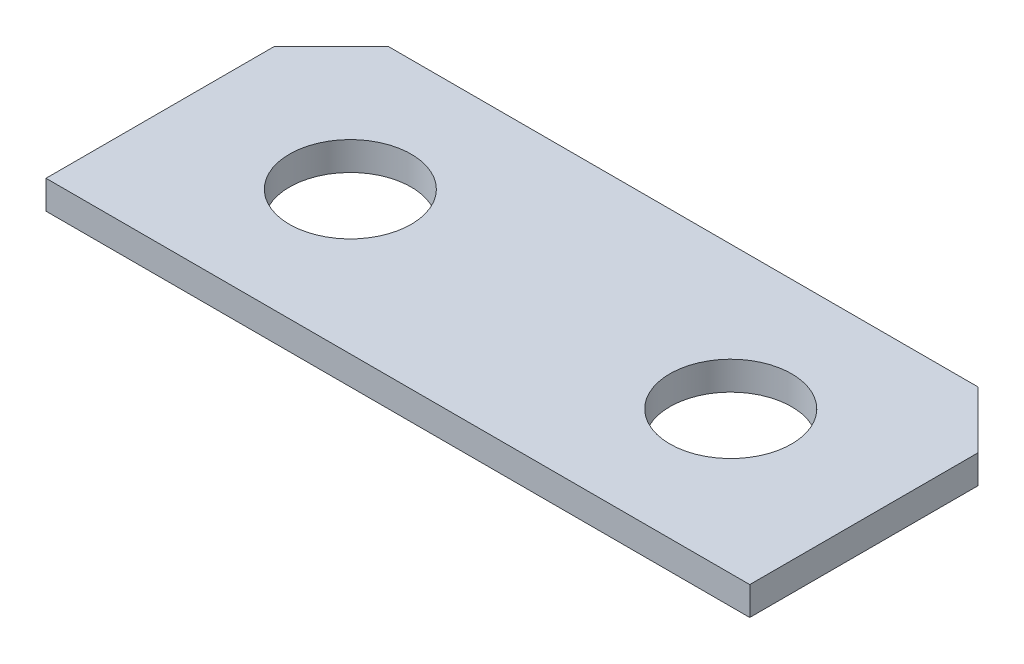
ISO-10303-21;
HEADER;
FILE_DESCRIPTION(('STEP AP214'),'2;1');
FILE_NAME('part.step','',(''),(''),'','','');
FILE_SCHEMA(('AUTOMOTIVE_DESIGN { 1 0 10303 214 1 1 1 1 }'));
ENDSEC;
DATA;
#1=APPLICATION_CONTEXT('core data for automotive mechanical design processes');
#2=APPLICATION_PROTOCOL_DEFINITION('international standard','automotive_design',2000,#1);
#3=PRODUCT_CONTEXT('',#1,'mechanical');
#4=PRODUCT('Part','Part','',(#3));
#5=PRODUCT_RELATED_PRODUCT_CATEGORY('part','',(#4));
#6=PRODUCT_DEFINITION_FORMATION('','',#4);
#7=PRODUCT_DEFINITION_CONTEXT('part definition',#1,'design');
#8=PRODUCT_DEFINITION('design','',#6,#7);
#9=PRODUCT_DEFINITION_SHAPE('','',#8);
#10=(LENGTH_UNIT() NAMED_UNIT(*) SI_UNIT(.MILLI.,.METRE.));
#11=(NAMED_UNIT(*) PLANE_ANGLE_UNIT() SI_UNIT($,.RADIAN.));
#12=(NAMED_UNIT(*) SI_UNIT($,.STERADIAN.) SOLID_ANGLE_UNIT());
#13=UNCERTAINTY_MEASURE_WITH_UNIT(LENGTH_MEASURE(1.E-05),#10,'distance_accuracy_value','');
#14=(GEOMETRIC_REPRESENTATION_CONTEXT(3) GLOBAL_UNCERTAINTY_ASSIGNED_CONTEXT((#13)) GLOBAL_UNIT_ASSIGNED_CONTEXT((#10,
#11,#12)) REPRESENTATION_CONTEXT('',''));
#15=CARTESIAN_POINT('',(0.,0.,0.));
#16=DIRECTION('',(0.,0.,1.));
#17=DIRECTION('',(1.,0.,0.));
#18=AXIS2_PLACEMENT_3D('',#15,#16,#17);
#19=CARTESIAN_POINT('',(-10.,0.,0.));
#20=DIRECTION('',(0.,1.,0.));
#21=DIRECTION('',(0.,0.,1.));
#22=AXIS2_PLACEMENT_3D('',#19,#20,#21);
#23=CYLINDRICAL_SURFACE('',#22,3.2);
#24=CARTESIAN_POINT('',(-10.,-1.5,0.));
#25=DIRECTION('',(0.,1.,0.));
#26=DIRECTION('',(0.,0.,1.));
#27=AXIS2_PLACEMENT_3D('',#24,#25,#26);
#28=CIRCLE('',#27,3.2);
#29=CARTESIAN_POINT('',(-10.,-1.5,3.2));
#30=VERTEX_POINT('',#29);
#31=EDGE_CURVE('E70',#30,#30,#28,.T.);
#32=ORIENTED_EDGE('',*,*,#31,.F.);
#33=EDGE_LOOP('',(#32));
#34=FACE_BOUND('',#33,.T.);
#35=CARTESIAN_POINT('',(-10.,0.,0.));
#36=DIRECTION('',(0.,1.,0.));
#37=DIRECTION('',(0.,0.,1.));
#38=AXIS2_PLACEMENT_3D('',#35,#36,#37);
#39=CIRCLE('',#38,3.2);
#40=CARTESIAN_POINT('',(-10.,0.,3.2));
#41=VERTEX_POINT('',#40);
#42=EDGE_CURVE('E25',#41,#41,#39,.T.);
#43=ORIENTED_EDGE('',*,*,#42,.T.);
#44=EDGE_LOOP('',(#43));
#45=FACE_BOUND('',#44,.T.);
#46=ADVANCED_FACE('F17',(#34,#45),#23,.F.);
#47=CARTESIAN_POINT('',(10.,0.,0.));
#48=DIRECTION('',(0.,1.,0.));
#49=DIRECTION('',(0.,0.,1.));
#50=AXIS2_PLACEMENT_3D('',#47,#48,#49);
#51=CYLINDRICAL_SURFACE('',#50,3.2);
#52=CARTESIAN_POINT('',(10.,-1.5,0.));
#53=DIRECTION('',(0.,1.,0.));
#54=DIRECTION('',(0.,0.,1.));
#55=AXIS2_PLACEMENT_3D('',#52,#53,#54);
#56=CIRCLE('',#55,3.2);
#57=CARTESIAN_POINT('',(10.,-1.5,3.2));
#58=VERTEX_POINT('',#57);
#59=EDGE_CURVE('E75',#58,#58,#56,.T.);
#60=ORIENTED_EDGE('',*,*,#59,.F.);
#61=EDGE_LOOP('',(#60));
#62=FACE_BOUND('',#61,.T.);
#63=CARTESIAN_POINT('',(10.,0.,0.));
#64=DIRECTION('',(0.,1.,0.));
#65=DIRECTION('',(0.,0.,1.));
#66=AXIS2_PLACEMENT_3D('',#63,#64,#65);
#67=CIRCLE('',#66,3.2);
#68=CARTESIAN_POINT('',(10.,0.,3.2));
#69=VERTEX_POINT('',#68);
#70=EDGE_CURVE('E11',#69,#69,#67,.T.);
#71=ORIENTED_EDGE('',*,*,#70,.T.);
#72=EDGE_LOOP('',(#71));
#73=FACE_BOUND('',#72,.T.);
#74=ADVANCED_FACE('F322',(#62,#73),#51,.F.);
#75=CARTESIAN_POINT('',(-15.5,-1.5,-7.5));
#76=DIRECTION('',(0.707106781186549,0.,0.707106781186546));
#77=DIRECTION('',(0.,-1.,0.));
#78=AXIS2_PLACEMENT_3D('',#75,#76,#77);
#79=PLANE('',#78);
#80=DIRECTION('',(0.707106781186546,0.,-0.707106781186549));
#81=VECTOR('',#80,1.);
#82=CARTESIAN_POINT('',(-15.5,-1.5,-7.5));
#83=LINE('',#82,#81);
#84=CARTESIAN_POINT('',(-18.5,-1.5,-4.5));
#85=VERTEX_POINT('',#84);
#86=CARTESIAN_POINT('',(-15.5,-1.5,-7.5));
#87=VERTEX_POINT('',#86);
#88=EDGE_CURVE('E76',#85,#87,#83,.T.);
#89=ORIENTED_EDGE('',*,*,#88,.F.);
#90=DIRECTION('',(0.,-1.,0.));
#91=VECTOR('',#90,1.);
#92=CARTESIAN_POINT('',(-18.5,-1.5,-4.5));
#93=LINE('',#92,#91);
#94=CARTESIAN_POINT('',(-18.5,0.,-4.5));
#95=VERTEX_POINT('',#94);
#96=EDGE_CURVE('E196',#95,#85,#93,.T.);
#97=ORIENTED_EDGE('',*,*,#96,.F.);
#98=DIRECTION('',(-0.707106781186546,0.,0.707106781186549));
#99=VECTOR('',#98,1.);
#100=CARTESIAN_POINT('',(-11.5,0.,-11.5));
#101=LINE('',#100,#99);
#102=CARTESIAN_POINT('',(-15.5,0.,-7.5));
#103=VERTEX_POINT('',#102);
#104=EDGE_CURVE('E95',#103,#95,#101,.T.);
#105=ORIENTED_EDGE('',*,*,#104,.F.);
#106=DIRECTION('',(0.,1.,0.));
#107=VECTOR('',#106,1.);
#108=CARTESIAN_POINT('',(-15.5,-1.5,-7.5));
#109=LINE('',#108,#107);
#110=EDGE_CURVE('E137',#87,#103,#109,.T.);
#111=ORIENTED_EDGE('',*,*,#110,.F.);
#112=EDGE_LOOP('',(#89,#97,#105,#111));
#113=FACE_BOUND('',#112,.T.);
#114=ADVANCED_FACE('F320',(#113),#79,.F.);
#115=CARTESIAN_POINT('',(18.5,-1.5,-4.5));
#116=DIRECTION('',(-0.707106781186546,0.,0.707106781186549));
#117=DIRECTION('',(0.,1.,0.));
#118=AXIS2_PLACEMENT_3D('',#115,#116,#117);
#119=PLANE('',#118);
#120=DIRECTION('',(0.707106781186549,0.,0.707106781186546));
#121=VECTOR('',#120,1.);
#122=CARTESIAN_POINT('',(18.5,-1.5,-4.5));
#123=LINE('',#122,#121);
#124=CARTESIAN_POINT('',(15.5,-1.5,-7.5));
#125=VERTEX_POINT('',#124);
#126=CARTESIAN_POINT('',(18.5,-1.5,-4.5));
#127=VERTEX_POINT('',#126);
#128=EDGE_CURVE('E86',#125,#127,#123,.T.);
#129=ORIENTED_EDGE('',*,*,#128,.F.);
#130=DIRECTION('',(0.,-1.,0.));
#131=VECTOR('',#130,1.);
#132=CARTESIAN_POINT('',(15.5,-1.5,-7.5));
#133=LINE('',#132,#131);
#134=CARTESIAN_POINT('',(15.5,0.,-7.5));
#135=VERTEX_POINT('',#134);
#136=EDGE_CURVE('E179',#135,#125,#133,.T.);
#137=ORIENTED_EDGE('',*,*,#136,.F.);
#138=DIRECTION('',(-0.707106781186549,0.,-0.707106781186546));
#139=VECTOR('',#138,1.);
#140=CARTESIAN_POINT('',(11.5,0.,-11.5));
#141=LINE('',#140,#139);
#142=CARTESIAN_POINT('',(18.5,0.,-4.5));
#143=VERTEX_POINT('',#142);
#144=EDGE_CURVE('E83',#143,#135,#141,.T.);
#145=ORIENTED_EDGE('',*,*,#144,.F.);
#146=DIRECTION('',(0.,1.,0.));
#147=VECTOR('',#146,1.);
#148=CARTESIAN_POINT('',(18.5,-1.5,-4.5));
#149=LINE('',#148,#147);
#150=EDGE_CURVE('E149',#127,#143,#149,.T.);
#151=ORIENTED_EDGE('',*,*,#150,.F.);
#152=EDGE_LOOP('',(#129,#137,#145,#151));
#153=FACE_BOUND('',#152,.T.);
#154=ADVANCED_FACE('F314',(#153),#119,.F.);
#155=CARTESIAN_POINT('',(0.,0.,0.));
#156=DIRECTION('',(0.,1.,0.));
#157=DIRECTION('',(1.,0.,0.));
#158=AXIS2_PLACEMENT_3D('',#155,#156,#157);
#159=PLANE('',#158);
#160=ORIENTED_EDGE('',*,*,#70,.F.);
#161=EDGE_LOOP('',(#160));
#162=FACE_BOUND('',#161,.T.);
#163=ORIENTED_EDGE('',*,*,#42,.F.);
#164=EDGE_LOOP('',(#163));
#165=FACE_BOUND('',#164,.T.);
#166=DIRECTION('',(0.,0.,-1.));
#167=VECTOR('',#166,1.);
#168=CARTESIAN_POINT('',(18.5,0.,7.5));
#169=LINE('',#168,#167);
#170=CARTESIAN_POINT('',(18.5,0.,7.5));
#171=VERTEX_POINT('',#170);
#172=EDGE_CURVE('E154',#171,#143,#169,.T.);
#173=ORIENTED_EDGE('',*,*,#172,.T.);
#174=ORIENTED_EDGE('',*,*,#144,.T.);
#175=DIRECTION('',(-1.,0.,0.));
#176=VECTOR('',#175,1.);
#177=CARTESIAN_POINT('',(18.5,0.,-7.5));
#178=LINE('',#177,#176);
#179=EDGE_CURVE('E206',#135,#103,#178,.T.);
#180=ORIENTED_EDGE('',*,*,#179,.T.);
#181=ORIENTED_EDGE('',*,*,#104,.T.);
#182=DIRECTION('',(0.,0.,1.));
#183=VECTOR('',#182,1.);
#184=CARTESIAN_POINT('',(-18.5,0.,7.5));
#185=LINE('',#184,#183);
#186=CARTESIAN_POINT('',(-18.5,0.,7.5));
#187=VERTEX_POINT('',#186);
#188=EDGE_CURVE('E228',#95,#187,#185,.T.);
#189=ORIENTED_EDGE('',*,*,#188,.T.);
#190=DIRECTION('',(1.,0.,0.));
#191=VECTOR('',#190,1.);
#192=CARTESIAN_POINT('',(18.5,0.,7.5));
#193=LINE('',#192,#191);
#194=EDGE_CURVE('E131',#187,#171,#193,.T.);
#195=ORIENTED_EDGE('',*,*,#194,.T.);
#196=EDGE_LOOP('',(#173,#174,#180,#181,#189,#195));
#197=FACE_BOUND('',#196,.T.);
#198=ADVANCED_FACE('F265',(#162,#165,#197),#159,.T.);
#199=CARTESIAN_POINT('',(0.,-1.5,0.));
#200=DIRECTION('',(0.,1.,0.));
#201=DIRECTION('',(1.,0.,0.));
#202=AXIS2_PLACEMENT_3D('',#199,#200,#201);
#203=PLANE('',#202);
#204=ORIENTED_EDGE('',*,*,#59,.T.);
#205=EDGE_LOOP('',(#204));
#206=FACE_BOUND('',#205,.T.);
#207=ORIENTED_EDGE('',*,*,#31,.T.);
#208=EDGE_LOOP('',(#207));
#209=FACE_BOUND('',#208,.T.);
#210=DIRECTION('',(-1.,0.,0.));
#211=VECTOR('',#210,1.);
#212=CARTESIAN_POINT('',(18.5,-1.5,-7.5));
#213=LINE('',#212,#211);
#214=EDGE_CURVE('E143',#125,#87,#213,.T.);
#215=ORIENTED_EDGE('',*,*,#214,.F.);
#216=ORIENTED_EDGE('',*,*,#128,.T.);
#217=DIRECTION('',(0.,0.,-1.));
#218=VECTOR('',#217,1.);
#219=CARTESIAN_POINT('',(18.5,-1.5,7.5));
#220=LINE('',#219,#218);
#221=CARTESIAN_POINT('',(18.5,-1.5,7.5));
#222=VERTEX_POINT('',#221);
#223=EDGE_CURVE('E142',#222,#127,#220,.T.);
#224=ORIENTED_EDGE('',*,*,#223,.F.);
#225=DIRECTION('',(1.,0.,0.));
#226=VECTOR('',#225,1.);
#227=CARTESIAN_POINT('',(18.5,-1.5,7.5));
#228=LINE('',#227,#226);
#229=CARTESIAN_POINT('',(-18.5,-1.5,7.5));
#230=VERTEX_POINT('',#229);
#231=EDGE_CURVE('E89',#230,#222,#228,.T.);
#232=ORIENTED_EDGE('',*,*,#231,.F.);
#233=DIRECTION('',(0.,0.,1.));
#234=VECTOR('',#233,1.);
#235=CARTESIAN_POINT('',(-18.5,-1.5,7.5));
#236=LINE('',#235,#234);
#237=EDGE_CURVE('E190',#85,#230,#236,.T.);
#238=ORIENTED_EDGE('',*,*,#237,.F.);
#239=ORIENTED_EDGE('',*,*,#88,.T.);
#240=EDGE_LOOP('',(#215,#216,#224,#232,#238,#239));
#241=FACE_BOUND('',#240,.T.);
#242=ADVANCED_FACE('F71',(#206,#209,#241),#203,.F.);
#243=CARTESIAN_POINT('',(18.5,-1.5,7.5));
#244=DIRECTION('',(0.,0.,1.));
#245=DIRECTION('',(1.,0.,0.));
#246=AXIS2_PLACEMENT_3D('',#243,#244,#245);
#247=PLANE('',#246);
#248=ORIENTED_EDGE('',*,*,#194,.F.);
#249=DIRECTION('',(0.,1.,0.));
#250=VECTOR('',#249,1.);
#251=CARTESIAN_POINT('',(-18.5,-1.5,7.5));
#252=LINE('',#251,#250);
#253=EDGE_CURVE('E195',#230,#187,#252,.T.);
#254=ORIENTED_EDGE('',*,*,#253,.F.);
#255=ORIENTED_EDGE('',*,*,#231,.T.);
#256=DIRECTION('',(0.,1.,0.));
#257=VECTOR('',#256,1.);
#258=CARTESIAN_POINT('',(18.5,-1.5,7.5));
#259=LINE('',#258,#257);
#260=EDGE_CURVE('E163',#222,#171,#259,.T.);
#261=ORIENTED_EDGE('',*,*,#260,.T.);
#262=EDGE_LOOP('',(#248,#254,#255,#261));
#263=FACE_BOUND('',#262,.T.);
#264=ADVANCED_FACE('F308',(#263),#247,.T.);
#265=CARTESIAN_POINT('',(18.5,-1.5,7.5));
#266=DIRECTION('',(1.,0.,0.));
#267=DIRECTION('',(0.,1.,0.));
#268=AXIS2_PLACEMENT_3D('',#265,#266,#267);
#269=PLANE('',#268);
#270=ORIENTED_EDGE('',*,*,#223,.T.);
#271=ORIENTED_EDGE('',*,*,#150,.T.);
#272=ORIENTED_EDGE('',*,*,#172,.F.);
#273=ORIENTED_EDGE('',*,*,#260,.F.);
#274=EDGE_LOOP('',(#270,#271,#272,#273));
#275=FACE_BOUND('',#274,.T.);
#276=ADVANCED_FACE('F311',(#275),#269,.T.);
#277=CARTESIAN_POINT('',(18.5,-1.5,-7.5));
#278=DIRECTION('',(0.,0.,-1.));
#279=DIRECTION('',(-1.,0.,0.));
#280=AXIS2_PLACEMENT_3D('',#277,#278,#279);
#281=PLANE('',#280);
#282=ORIENTED_EDGE('',*,*,#179,.F.);
#283=ORIENTED_EDGE('',*,*,#136,.T.);
#284=ORIENTED_EDGE('',*,*,#214,.T.);
#285=ORIENTED_EDGE('',*,*,#110,.T.);
#286=EDGE_LOOP('',(#282,#283,#284,#285));
#287=FACE_BOUND('',#286,.T.);
#288=ADVANCED_FACE('F317',(#287),#281,.T.);
#289=CARTESIAN_POINT('',(-18.5,-1.5,7.5));
#290=DIRECTION('',(-1.,0.,0.));
#291=DIRECTION('',(0.,0.,1.));
#292=AXIS2_PLACEMENT_3D('',#289,#290,#291);
#293=PLANE('',#292);
#294=ORIENTED_EDGE('',*,*,#188,.F.);
#295=ORIENTED_EDGE('',*,*,#96,.T.);
#296=ORIENTED_EDGE('',*,*,#237,.T.);
#297=ORIENTED_EDGE('',*,*,#253,.T.);
#298=EDGE_LOOP('',(#294,#295,#296,#297));
#299=FACE_BOUND('',#298,.T.);
#300=ADVANCED_FACE('F274',(#299),#293,.T.);
#301=CLOSED_SHELL('',(#46,#74,#114,#154,#198,#242,#264,#276,#288,#300));
#302=MANIFOLD_SOLID_BREP('B1',#301);
#303=ADVANCED_BREP_SHAPE_REPRESENTATION('',(#18,#302),#14);
#304=SHAPE_DEFINITION_REPRESENTATION(#9,#303);
ENDSEC;
END-ISO-10303-21;
